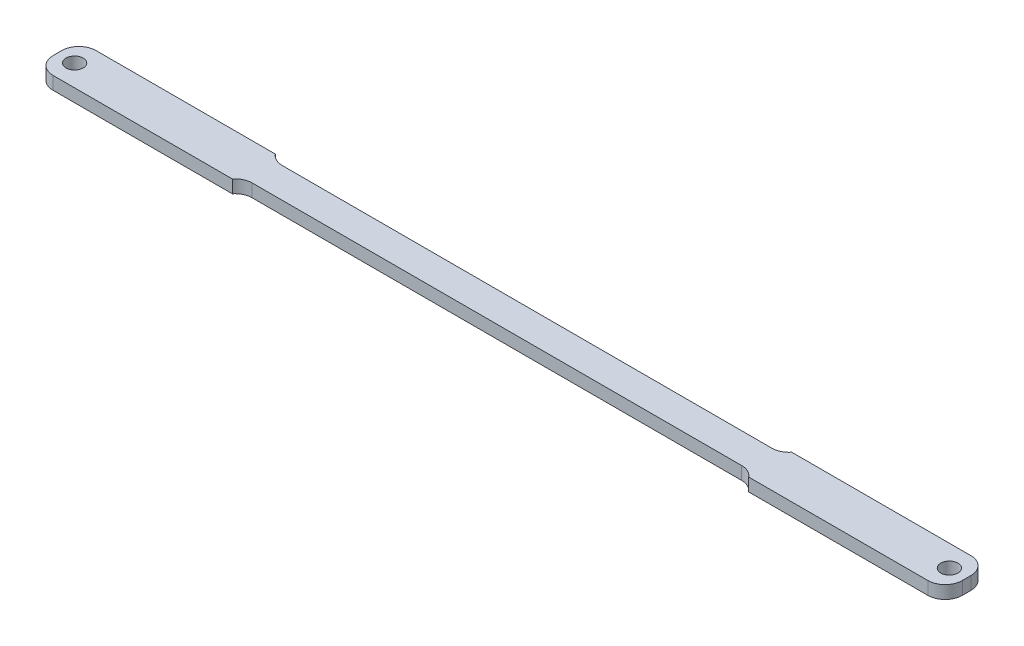
ISO-10303-21;
HEADER;
FILE_DESCRIPTION(('STEP AP214'),'2;1');
FILE_NAME('part.step','',(''),(''),'','','');
FILE_SCHEMA(('AUTOMOTIVE_DESIGN { 1 0 10303 214 1 1 1 1 }'));
ENDSEC;
DATA;
#1=APPLICATION_CONTEXT('core data for automotive mechanical design processes');
#2=APPLICATION_PROTOCOL_DEFINITION('international standard','automotive_design',2000,#1);
#3=PRODUCT_CONTEXT('',#1,'mechanical');
#4=PRODUCT('Part','Part','',(#3));
#5=PRODUCT_RELATED_PRODUCT_CATEGORY('part','',(#4));
#6=PRODUCT_DEFINITION_FORMATION('','',#4);
#7=PRODUCT_DEFINITION_CONTEXT('part definition',#1,'design');
#8=PRODUCT_DEFINITION('design','',#6,#7);
#9=PRODUCT_DEFINITION_SHAPE('','',#8);
#10=(LENGTH_UNIT() NAMED_UNIT(*) SI_UNIT(.MILLI.,.METRE.));
#11=(NAMED_UNIT(*) PLANE_ANGLE_UNIT() SI_UNIT($,.RADIAN.));
#12=(NAMED_UNIT(*) SI_UNIT($,.STERADIAN.) SOLID_ANGLE_UNIT());
#13=UNCERTAINTY_MEASURE_WITH_UNIT(LENGTH_MEASURE(1.E-05),#10,'distance_accuracy_value','');
#14=(GEOMETRIC_REPRESENTATION_CONTEXT(3) GLOBAL_UNCERTAINTY_ASSIGNED_CONTEXT((#13)) GLOBAL_UNIT_ASSIGNED_CONTEXT((#10,
#11,#12)) REPRESENTATION_CONTEXT('',''));
#15=CARTESIAN_POINT('',(0.,0.,0.));
#16=DIRECTION('',(0.,0.,1.));
#17=DIRECTION('',(1.,0.,0.));
#18=AXIS2_PLACEMENT_3D('',#15,#16,#17);
#19=CARTESIAN_POINT('',(-50.82,1.5,-2.5));
#20=DIRECTION('',(0.,0.,1.));
#21=DIRECTION('',(1.,0.,0.));
#22=AXIS2_PLACEMENT_3D('',#19,#20,#21);
#23=PLANE('',#22);
#24=DIRECTION('',(-1.,0.,0.));
#25=VECTOR('',#24,1.);
#26=CARTESIAN_POINT('',(-50.82,0.,-2.5));
#27=LINE('',#26,#25);
#28=CARTESIAN_POINT('',(50.82,0.,-2.5));
#29=VERTEX_POINT('',#28);
#30=CARTESIAN_POINT('',(30.,0.,-2.5));
#31=VERTEX_POINT('',#30);
#32=EDGE_CURVE('E308',#29,#31,#27,.T.);
#33=ORIENTED_EDGE('',*,*,#32,.T.);
#34=DIRECTION('',(0.,1.,0.));
#35=VECTOR('',#34,1.);
#36=CARTESIAN_POINT('',(30.,1.5,-2.5));
#37=LINE('',#36,#35);
#38=CARTESIAN_POINT('',(30.,1.5,-2.5));
#39=VERTEX_POINT('',#38);
#40=EDGE_CURVE('E186',#31,#39,#37,.T.);
#41=ORIENTED_EDGE('',*,*,#40,.T.);
#42=DIRECTION('',(-1.,0.,0.));
#43=VECTOR('',#42,1.);
#44=CARTESIAN_POINT('',(-50.82,1.5,-2.5));
#45=LINE('',#44,#43);
#46=CARTESIAN_POINT('',(50.82,1.5,-2.5));
#47=VERTEX_POINT('',#46);
#48=EDGE_CURVE('E237',#47,#39,#45,.T.);
#49=ORIENTED_EDGE('',*,*,#48,.F.);
#50=DIRECTION('',(0.,-1.,0.));
#51=VECTOR('',#50,1.);
#52=CARTESIAN_POINT('',(50.82,1.5,-2.5));
#53=LINE('',#52,#51);
#54=EDGE_CURVE('E341',#47,#29,#53,.T.);
#55=ORIENTED_EDGE('',*,*,#54,.T.);
#56=EDGE_LOOP('',(#33,#41,#49,#55));
#57=FACE_BOUND('',#56,.T.);
#58=ADVANCED_FACE('F39',(#57),#23,.F.);
#59=CARTESIAN_POINT('',(-50.82,1.5,2.5));
#60=DIRECTION('',(0.,0.,-1.));
#61=DIRECTION('',(-1.,0.,0.));
#62=AXIS2_PLACEMENT_3D('',#59,#60,#61);
#63=PLANE('',#62);
#64=DIRECTION('',(1.,0.,0.));
#65=VECTOR('',#64,1.);
#66=CARTESIAN_POINT('',(-50.82,1.5,2.5));
#67=LINE('',#66,#65);
#68=CARTESIAN_POINT('',(30.,1.5,2.5));
#69=VERTEX_POINT('',#68);
#70=CARTESIAN_POINT('',(50.82,1.5,2.5));
#71=VERTEX_POINT('',#70);
#72=EDGE_CURVE('E159',#69,#71,#67,.T.);
#73=ORIENTED_EDGE('',*,*,#72,.F.);
#74=DIRECTION('',(0.,-1.,0.));
#75=VECTOR('',#74,1.);
#76=CARTESIAN_POINT('',(30.,1.5,2.5));
#77=LINE('',#76,#75);
#78=CARTESIAN_POINT('',(30.,0.,2.5));
#79=VERTEX_POINT('',#78);
#80=EDGE_CURVE('E171',#69,#79,#77,.T.);
#81=ORIENTED_EDGE('',*,*,#80,.T.);
#82=DIRECTION('',(1.,0.,0.));
#83=VECTOR('',#82,1.);
#84=CARTESIAN_POINT('',(-50.82,0.,2.5));
#85=LINE('',#84,#83);
#86=CARTESIAN_POINT('',(50.82,0.,2.5));
#87=VERTEX_POINT('',#86);
#88=EDGE_CURVE('E321',#79,#87,#85,.T.);
#89=ORIENTED_EDGE('',*,*,#88,.T.);
#90=DIRECTION('',(0.,-1.,0.));
#91=VECTOR('',#90,1.);
#92=CARTESIAN_POINT('',(50.82,1.5,2.5));
#93=LINE('',#92,#91);
#94=EDGE_CURVE('E173',#71,#87,#93,.T.);
#95=ORIENTED_EDGE('',*,*,#94,.F.);
#96=EDGE_LOOP('',(#73,#81,#89,#95));
#97=FACE_BOUND('',#96,.T.);
#98=ADVANCED_FACE('F170',(#97),#63,.F.);
#99=CARTESIAN_POINT('',(50.82,1.5,0.5));
#100=DIRECTION('',(0.,1.,0.));
#101=DIRECTION('',(0.,0.,1.));
#102=AXIS2_PLACEMENT_3D('',#99,#100,#101);
#103=PLANE('',#102);
#104=ORIENTED_EDGE('',*,*,#48,.T.);
#105=CARTESIAN_POINT('',(28.4387505004004,1.5,-3.75000000000001));
#106=DIRECTION('',(0.,1.,0.));
#107=DIRECTION('',(0.,0.,1.));
#108=AXIS2_PLACEMENT_3D('',#105,#106,#107);
#109=CIRCLE('',#108,2.);
#110=CARTESIAN_POINT('',(28.4387505004004,1.5,-1.75000000000001));
#111=VERTEX_POINT('',#110);
#112=EDGE_CURVE('E208',#39,#111,#109,.F.);
#113=ORIENTED_EDGE('',*,*,#112,.T.);
#114=DIRECTION('',(1.,0.,0.));
#115=VECTOR('',#114,1.);
#116=CARTESIAN_POINT('',(-30.,1.5,-1.75000000000001));
#117=LINE('',#116,#115);
#118=CARTESIAN_POINT('',(-28.4387505004004,1.5,-1.75000000000001));
#119=VERTEX_POINT('',#118);
#120=EDGE_CURVE('E226',#119,#111,#117,.T.);
#121=ORIENTED_EDGE('',*,*,#120,.F.);
#122=CARTESIAN_POINT('',(-28.4387505004004,1.5,-3.75000000000001));
#123=DIRECTION('',(0.,1.,0.));
#124=DIRECTION('',(0.,0.,1.));
#125=AXIS2_PLACEMENT_3D('',#122,#123,#124);
#126=CIRCLE('',#125,2.);
#127=CARTESIAN_POINT('',(-30.,1.5,-2.5));
#128=VERTEX_POINT('',#127);
#129=EDGE_CURVE('E48',#119,#128,#126,.F.);
#130=ORIENTED_EDGE('',*,*,#129,.T.);
#131=CARTESIAN_POINT('',(-50.82,1.5,-2.5));
#132=VERTEX_POINT('',#131);
#133=EDGE_CURVE('E223',#128,#132,#45,.T.);
#134=ORIENTED_EDGE('',*,*,#133,.T.);
#135=CARTESIAN_POINT('',(-50.82,1.5,-0.5));
#136=DIRECTION('',(0.,1.,0.));
#137=DIRECTION('',(0.,0.,1.));
#138=AXIS2_PLACEMENT_3D('',#135,#136,#137);
#139=CIRCLE('',#138,2.);
#140=CARTESIAN_POINT('',(-52.82,1.5,-0.5));
#141=VERTEX_POINT('',#140);
#142=EDGE_CURVE('E289',#132,#141,#139,.T.);
#143=ORIENTED_EDGE('',*,*,#142,.T.);
#144=DIRECTION('',(0.,0.,1.));
#145=VECTOR('',#144,1.);
#146=CARTESIAN_POINT('',(-52.82,1.5,-0.5));
#147=LINE('',#146,#145);
#148=CARTESIAN_POINT('',(-52.82,1.5,0.499999999999999));
#149=VERTEX_POINT('',#148);
#150=EDGE_CURVE('E292',#141,#149,#147,.T.);
#151=ORIENTED_EDGE('',*,*,#150,.T.);
#152=CARTESIAN_POINT('',(-50.82,1.5,0.5));
#153=DIRECTION('',(0.,1.,0.));
#154=DIRECTION('',(0.,0.,1.));
#155=AXIS2_PLACEMENT_3D('',#152,#153,#154);
#156=CIRCLE('',#155,2.);
#157=CARTESIAN_POINT('',(-50.82,1.5,2.5));
#158=VERTEX_POINT('',#157);
#159=EDGE_CURVE('E177',#149,#158,#156,.T.);
#160=ORIENTED_EDGE('',*,*,#159,.T.);
#161=CARTESIAN_POINT('',(-30.,1.5,2.5));
#162=VERTEX_POINT('',#161);
#163=EDGE_CURVE('E176',#158,#162,#67,.T.);
#164=ORIENTED_EDGE('',*,*,#163,.T.);
#165=CARTESIAN_POINT('',(-28.4387505004004,1.5,3.75));
#166=DIRECTION('',(0.,1.,0.));
#167=DIRECTION('',(0.,0.,1.));
#168=AXIS2_PLACEMENT_3D('',#165,#166,#167);
#169=CIRCLE('',#168,2.);
#170=CARTESIAN_POINT('',(-28.4387505004004,1.5,1.75));
#171=VERTEX_POINT('',#170);
#172=EDGE_CURVE('E215',#162,#171,#169,.F.);
#173=ORIENTED_EDGE('',*,*,#172,.T.);
#174=DIRECTION('',(-1.,0.,0.));
#175=VECTOR('',#174,1.);
#176=CARTESIAN_POINT('',(-30.,1.5,1.75));
#177=LINE('',#176,#175);
#178=CARTESIAN_POINT('',(28.4387505004004,1.5,1.75));
#179=VERTEX_POINT('',#178);
#180=EDGE_CURVE('E161',#179,#171,#177,.T.);
#181=ORIENTED_EDGE('',*,*,#180,.F.);
#182=CARTESIAN_POINT('',(28.4387505004004,1.5,3.75));
#183=DIRECTION('',(0.,1.,0.));
#184=DIRECTION('',(0.,0.,1.));
#185=AXIS2_PLACEMENT_3D('',#182,#183,#184);
#186=CIRCLE('',#185,2.);
#187=EDGE_CURVE('E153',#179,#69,#186,.F.);
#188=ORIENTED_EDGE('',*,*,#187,.T.);
#189=ORIENTED_EDGE('',*,*,#72,.T.);
#190=CARTESIAN_POINT('',(50.82,1.5,0.5));
#191=DIRECTION('',(0.,1.,0.));
#192=DIRECTION('',(0.,0.,1.));
#193=AXIS2_PLACEMENT_3D('',#190,#191,#192);
#194=CIRCLE('',#193,2.);
#195=CARTESIAN_POINT('',(52.82,1.5,0.499999999999999));
#196=VERTEX_POINT('',#195);
#197=EDGE_CURVE('E279',#71,#196,#194,.T.);
#198=ORIENTED_EDGE('',*,*,#197,.T.);
#199=DIRECTION('',(0.,0.,-1.));
#200=VECTOR('',#199,1.);
#201=CARTESIAN_POINT('',(52.82,1.5,-0.500000000000001));
#202=LINE('',#201,#200);
#203=CARTESIAN_POINT('',(52.82,1.5,-0.500000000000001));
#204=VERTEX_POINT('',#203);
#205=EDGE_CURVE('E282',#196,#204,#202,.T.);
#206=ORIENTED_EDGE('',*,*,#205,.T.);
#207=CARTESIAN_POINT('',(50.82,1.5,-0.5));
#208=DIRECTION('',(0.,1.,0.));
#209=DIRECTION('',(0.,0.,-1.));
#210=AXIS2_PLACEMENT_3D('',#207,#208,#209);
#211=CIRCLE('',#210,2.);
#212=EDGE_CURVE('E238',#204,#47,#211,.T.);
#213=ORIENTED_EDGE('',*,*,#212,.T.);
#214=EDGE_LOOP('',(#104,#113,#121,#130,#134,#143,#151,#160,#164,#173,#181,#188,#189,#198,#206,#213));
#215=FACE_BOUND('',#214,.T.);
#216=CARTESIAN_POINT('',(-50.82,1.5,0.));
#217=DIRECTION('',(0.,1.,0.));
#218=DIRECTION('',(0.,0.,1.));
#219=AXIS2_PLACEMENT_3D('',#216,#217,#218);
#220=CIRCLE('',#219,0.999999999999998);
#221=CARTESIAN_POINT('',(-50.82,1.5,0.999999999999998));
#222=VERTEX_POINT('',#221);
#223=EDGE_CURVE('E271',#222,#222,#220,.T.);
#224=ORIENTED_EDGE('',*,*,#223,.F.);
#225=EDGE_LOOP('',(#224));
#226=FACE_BOUND('',#225,.T.);
#227=CARTESIAN_POINT('',(50.82,1.5,0.));
#228=DIRECTION('',(0.,1.,0.));
#229=DIRECTION('',(0.,0.,1.));
#230=AXIS2_PLACEMENT_3D('',#227,#228,#229);
#231=CIRCLE('',#230,0.999999999999998);
#232=CARTESIAN_POINT('',(50.82,1.5,0.999999999999999));
#233=VERTEX_POINT('',#232);
#234=EDGE_CURVE('E258',#233,#233,#231,.T.);
#235=ORIENTED_EDGE('',*,*,#234,.F.);
#236=EDGE_LOOP('',(#235));
#237=FACE_BOUND('',#236,.T.);
#238=ADVANCED_FACE('F156',(#215,#226,#237),#103,.T.);
#239=CARTESIAN_POINT('',(50.82,0.,0.5));
#240=DIRECTION('',(0.,1.,0.));
#241=DIRECTION('',(0.,0.,1.));
#242=AXIS2_PLACEMENT_3D('',#239,#240,#241);
#243=PLANE('',#242);
#244=CARTESIAN_POINT('',(-30.,0.,-2.5));
#245=VERTEX_POINT('',#244);
#246=CARTESIAN_POINT('',(-50.82,0.,-2.5));
#247=VERTEX_POINT('',#246);
#248=EDGE_CURVE('E248',#245,#247,#27,.T.);
#249=ORIENTED_EDGE('',*,*,#248,.F.);
#250=CARTESIAN_POINT('',(-28.4387505004004,0.,-3.75000000000001));
#251=DIRECTION('',(0.,1.,0.));
#252=DIRECTION('',(0.,0.,1.));
#253=AXIS2_PLACEMENT_3D('',#250,#251,#252);
#254=CIRCLE('',#253,2.);
#255=CARTESIAN_POINT('',(-28.4387505004004,0.,-1.75000000000001));
#256=VERTEX_POINT('',#255);
#257=EDGE_CURVE('E11',#245,#256,#254,.T.);
#258=ORIENTED_EDGE('',*,*,#257,.T.);
#259=DIRECTION('',(1.,0.,0.));
#260=VECTOR('',#259,1.);
#261=CARTESIAN_POINT('',(-30.,0.,-1.75000000000001));
#262=LINE('',#261,#260);
#263=CARTESIAN_POINT('',(28.4387505004004,0.,-1.75000000000001));
#264=VERTEX_POINT('',#263);
#265=EDGE_CURVE('E245',#256,#264,#262,.T.);
#266=ORIENTED_EDGE('',*,*,#265,.T.);
#267=CARTESIAN_POINT('',(28.4387505004004,0.,-3.75000000000001));
#268=DIRECTION('',(0.,1.,0.));
#269=DIRECTION('',(0.,0.,1.));
#270=AXIS2_PLACEMENT_3D('',#267,#268,#269);
#271=CIRCLE('',#270,2.);
#272=EDGE_CURVE('E167',#264,#31,#271,.T.);
#273=ORIENTED_EDGE('',*,*,#272,.T.);
#274=ORIENTED_EDGE('',*,*,#32,.F.);
#275=CARTESIAN_POINT('',(50.82,0.,-0.5));
#276=DIRECTION('',(0.,1.,0.));
#277=DIRECTION('',(0.,0.,-1.));
#278=AXIS2_PLACEMENT_3D('',#275,#276,#277);
#279=CIRCLE('',#278,2.);
#280=CARTESIAN_POINT('',(52.82,0.,-0.500000000000001));
#281=VERTEX_POINT('',#280);
#282=EDGE_CURVE('E305',#281,#29,#279,.T.);
#283=ORIENTED_EDGE('',*,*,#282,.F.);
#284=DIRECTION('',(0.,0.,-1.));
#285=VECTOR('',#284,1.);
#286=CARTESIAN_POINT('',(52.82,0.,-0.500000000000001));
#287=LINE('',#286,#285);
#288=CARTESIAN_POINT('',(52.82,0.,0.499999999999999));
#289=VERTEX_POINT('',#288);
#290=EDGE_CURVE('E302',#289,#281,#287,.T.);
#291=ORIENTED_EDGE('',*,*,#290,.F.);
#292=CARTESIAN_POINT('',(50.82,0.,0.5));
#293=DIRECTION('',(0.,1.,0.));
#294=DIRECTION('',(0.,0.,1.));
#295=AXIS2_PLACEMENT_3D('',#292,#293,#294);
#296=CIRCLE('',#295,2.);
#297=EDGE_CURVE('E275',#87,#289,#296,.T.);
#298=ORIENTED_EDGE('',*,*,#297,.F.);
#299=ORIENTED_EDGE('',*,*,#88,.F.);
#300=CARTESIAN_POINT('',(28.4387505004004,0.,3.75));
#301=DIRECTION('',(0.,1.,0.));
#302=DIRECTION('',(0.,0.,1.));
#303=AXIS2_PLACEMENT_3D('',#300,#301,#302);
#304=CIRCLE('',#303,2.);
#305=CARTESIAN_POINT('',(28.4387505004004,0.,1.75));
#306=VERTEX_POINT('',#305);
#307=EDGE_CURVE('E62',#79,#306,#304,.T.);
#308=ORIENTED_EDGE('',*,*,#307,.T.);
#309=DIRECTION('',(-1.,0.,0.));
#310=VECTOR('',#309,1.);
#311=CARTESIAN_POINT('',(-30.,0.,1.75));
#312=LINE('',#311,#310);
#313=CARTESIAN_POINT('',(-28.4387505004004,0.,1.75));
#314=VERTEX_POINT('',#313);
#315=EDGE_CURVE('E260',#306,#314,#312,.T.);
#316=ORIENTED_EDGE('',*,*,#315,.T.);
#317=CARTESIAN_POINT('',(-28.4387505004004,0.,3.75));
#318=DIRECTION('',(0.,1.,0.));
#319=DIRECTION('',(0.,0.,1.));
#320=AXIS2_PLACEMENT_3D('',#317,#318,#319);
#321=CIRCLE('',#320,2.);
#322=CARTESIAN_POINT('',(-30.,0.,2.5));
#323=VERTEX_POINT('',#322);
#324=EDGE_CURVE('E218',#314,#323,#321,.T.);
#325=ORIENTED_EDGE('',*,*,#324,.T.);
#326=CARTESIAN_POINT('',(-50.82,0.,2.5));
#327=VERTEX_POINT('',#326);
#328=EDGE_CURVE('E283',#327,#323,#85,.T.);
#329=ORIENTED_EDGE('',*,*,#328,.F.);
#330=CARTESIAN_POINT('',(-50.82,0.,0.5));
#331=DIRECTION('',(0.,1.,0.));
#332=DIRECTION('',(0.,0.,1.));
#333=AXIS2_PLACEMENT_3D('',#330,#331,#332);
#334=CIRCLE('',#333,2.);
#335=CARTESIAN_POINT('',(-52.82,0.,0.499999999999999));
#336=VERTEX_POINT('',#335);
#337=EDGE_CURVE('E318',#336,#327,#334,.T.);
#338=ORIENTED_EDGE('',*,*,#337,.F.);
#339=DIRECTION('',(0.,0.,1.));
#340=VECTOR('',#339,1.);
#341=CARTESIAN_POINT('',(-52.82,0.,-0.5));
#342=LINE('',#341,#340);
#343=CARTESIAN_POINT('',(-52.82,0.,-0.5));
#344=VERTEX_POINT('',#343);
#345=EDGE_CURVE('E315',#344,#336,#342,.T.);
#346=ORIENTED_EDGE('',*,*,#345,.F.);
#347=CARTESIAN_POINT('',(-50.82,0.,-0.5));
#348=DIRECTION('',(0.,1.,0.));
#349=DIRECTION('',(0.,0.,1.));
#350=AXIS2_PLACEMENT_3D('',#347,#348,#349);
#351=CIRCLE('',#350,2.);
#352=EDGE_CURVE('E312',#247,#344,#351,.T.);
#353=ORIENTED_EDGE('',*,*,#352,.F.);
#354=EDGE_LOOP('',(#249,#258,#266,#273,#274,#283,#291,#298,#299,#308,#316,#325,#329,#338,#346,#353));
#355=FACE_BOUND('',#354,.T.);
#356=CARTESIAN_POINT('',(-50.82,0.,0.));
#357=DIRECTION('',(0.,1.,0.));
#358=DIRECTION('',(0.,0.,1.));
#359=AXIS2_PLACEMENT_3D('',#356,#357,#358);
#360=CIRCLE('',#359,0.999999999999998);
#361=CARTESIAN_POINT('',(-50.82,0.,0.999999999999998));
#362=VERTEX_POINT('',#361);
#363=EDGE_CURVE('E269',#362,#362,#360,.T.);
#364=ORIENTED_EDGE('',*,*,#363,.T.);
#365=EDGE_LOOP('',(#364));
#366=FACE_BOUND('',#365,.T.);
#367=CARTESIAN_POINT('',(50.82,0.,0.));
#368=DIRECTION('',(0.,1.,0.));
#369=DIRECTION('',(0.,0.,1.));
#370=AXIS2_PLACEMENT_3D('',#367,#368,#369);
#371=CIRCLE('',#370,0.999999999999998);
#372=CARTESIAN_POINT('',(50.82,0.,0.999999999999999));
#373=VERTEX_POINT('',#372);
#374=EDGE_CURVE('E253',#373,#373,#371,.T.);
#375=ORIENTED_EDGE('',*,*,#374,.T.);
#376=EDGE_LOOP('',(#375));
#377=FACE_BOUND('',#376,.T.);
#378=ADVANCED_FACE('F243',(#355,#366,#377),#243,.F.);
#379=CARTESIAN_POINT('',(50.82,1.5,0.5));
#380=DIRECTION('',(0.,-1.,0.));
#381=DIRECTION('',(0.,0.,-1.));
#382=AXIS2_PLACEMENT_3D('',#379,#380,#381);
#383=CYLINDRICAL_SURFACE('',#382,2.);
#384=ORIENTED_EDGE('',*,*,#297,.T.);
#385=DIRECTION('',(0.,-1.,0.));
#386=VECTOR('',#385,1.);
#387=CARTESIAN_POINT('',(52.82,1.5,0.499999999999999));
#388=LINE('',#387,#386);
#389=EDGE_CURVE('E189',#196,#289,#388,.T.);
#390=ORIENTED_EDGE('',*,*,#389,.F.);
#391=ORIENTED_EDGE('',*,*,#197,.F.);
#392=ORIENTED_EDGE('',*,*,#94,.T.);
#393=EDGE_LOOP('',(#384,#390,#391,#392));
#394=FACE_BOUND('',#393,.T.);
#395=ADVANCED_FACE('F356',(#394),#383,.T.);
#396=CARTESIAN_POINT('',(52.82,1.5,-0.500000000000001));
#397=DIRECTION('',(-1.,0.,0.));
#398=DIRECTION('',(0.,0.,1.));
#399=AXIS2_PLACEMENT_3D('',#396,#397,#398);
#400=PLANE('',#399);
#401=ORIENTED_EDGE('',*,*,#290,.T.);
#402=DIRECTION('',(0.,-1.,0.));
#403=VECTOR('',#402,1.);
#404=CARTESIAN_POINT('',(52.82,1.5,-0.500000000000001));
#405=LINE('',#404,#403);
#406=EDGE_CURVE('E345',#204,#281,#405,.T.);
#407=ORIENTED_EDGE('',*,*,#406,.F.);
#408=ORIENTED_EDGE('',*,*,#205,.F.);
#409=ORIENTED_EDGE('',*,*,#389,.T.);
#410=EDGE_LOOP('',(#401,#407,#408,#409));
#411=FACE_BOUND('',#410,.T.);
#412=ADVANCED_FACE('F352',(#411),#400,.F.);
#413=CARTESIAN_POINT('',(50.82,1.5,-0.5));
#414=DIRECTION('',(0.,-1.,0.));
#415=DIRECTION('',(0.,0.,-1.));
#416=AXIS2_PLACEMENT_3D('',#413,#414,#415);
#417=CYLINDRICAL_SURFACE('',#416,2.);
#418=ORIENTED_EDGE('',*,*,#282,.T.);
#419=ORIENTED_EDGE('',*,*,#54,.F.);
#420=ORIENTED_EDGE('',*,*,#212,.F.);
#421=ORIENTED_EDGE('',*,*,#406,.T.);
#422=EDGE_LOOP('',(#418,#419,#420,#421));
#423=FACE_BOUND('',#422,.T.);
#424=ADVANCED_FACE('F361',(#423),#417,.T.);
#425=ORIENTED_EDGE('',*,*,#133,.F.);
#426=DIRECTION('',(0.,-1.,0.));
#427=VECTOR('',#426,1.);
#428=CARTESIAN_POINT('',(-30.,1.5,-2.5));
#429=LINE('',#428,#427);
#430=EDGE_CURVE('E181',#128,#245,#429,.T.);
#431=ORIENTED_EDGE('',*,*,#430,.T.);
#432=ORIENTED_EDGE('',*,*,#248,.T.);
#433=DIRECTION('',(0.,-1.,0.));
#434=VECTOR('',#433,1.);
#435=CARTESIAN_POINT('',(-50.82,1.5,-2.5));
#436=LINE('',#435,#434);
#437=EDGE_CURVE('E234',#132,#247,#436,.T.);
#438=ORIENTED_EDGE('',*,*,#437,.F.);
#439=EDGE_LOOP('',(#425,#431,#432,#438));
#440=FACE_BOUND('',#439,.T.);
#441=ADVANCED_FACE('F231',(#440),#23,.F.);
#442=CARTESIAN_POINT('',(-50.82,1.5,-0.5));
#443=DIRECTION('',(0.,-1.,0.));
#444=DIRECTION('',(0.,0.,-1.));
#445=AXIS2_PLACEMENT_3D('',#442,#443,#444);
#446=CYLINDRICAL_SURFACE('',#445,2.);
#447=ORIENTED_EDGE('',*,*,#352,.T.);
#448=DIRECTION('',(0.,-1.,0.));
#449=VECTOR('',#448,1.);
#450=CARTESIAN_POINT('',(-52.82,1.5,-0.5));
#451=LINE('',#450,#449);
#452=EDGE_CURVE('E335',#141,#344,#451,.T.);
#453=ORIENTED_EDGE('',*,*,#452,.F.);
#454=ORIENTED_EDGE('',*,*,#142,.F.);
#455=ORIENTED_EDGE('',*,*,#437,.T.);
#456=EDGE_LOOP('',(#447,#453,#454,#455));
#457=FACE_BOUND('',#456,.T.);
#458=ADVANCED_FACE('F389',(#457),#446,.T.);
#459=CARTESIAN_POINT('',(-52.82,1.5,-0.5));
#460=DIRECTION('',(1.,0.,0.));
#461=DIRECTION('',(0.,0.,-1.));
#462=AXIS2_PLACEMENT_3D('',#459,#460,#461);
#463=PLANE('',#462);
#464=ORIENTED_EDGE('',*,*,#345,.T.);
#465=DIRECTION('',(0.,-1.,0.));
#466=VECTOR('',#465,1.);
#467=CARTESIAN_POINT('',(-52.82,1.5,0.499999999999999));
#468=LINE('',#467,#466);
#469=EDGE_CURVE('E331',#149,#336,#468,.T.);
#470=ORIENTED_EDGE('',*,*,#469,.F.);
#471=ORIENTED_EDGE('',*,*,#150,.F.);
#472=ORIENTED_EDGE('',*,*,#452,.T.);
#473=EDGE_LOOP('',(#464,#470,#471,#472));
#474=FACE_BOUND('',#473,.T.);
#475=ADVANCED_FACE('F394',(#474),#463,.F.);
#476=CARTESIAN_POINT('',(-50.82,1.5,0.5));
#477=DIRECTION('',(0.,-1.,0.));
#478=DIRECTION('',(0.,0.,-1.));
#479=AXIS2_PLACEMENT_3D('',#476,#477,#478);
#480=CYLINDRICAL_SURFACE('',#479,2.);
#481=ORIENTED_EDGE('',*,*,#337,.T.);
#482=DIRECTION('',(0.,-1.,0.));
#483=VECTOR('',#482,1.);
#484=CARTESIAN_POINT('',(-50.82,1.5,2.5));
#485=LINE('',#484,#483);
#486=EDGE_CURVE('E327',#158,#327,#485,.T.);
#487=ORIENTED_EDGE('',*,*,#486,.F.);
#488=ORIENTED_EDGE('',*,*,#159,.F.);
#489=ORIENTED_EDGE('',*,*,#469,.T.);
#490=EDGE_LOOP('',(#481,#487,#488,#489));
#491=FACE_BOUND('',#490,.T.);
#492=ADVANCED_FACE('F413',(#491),#480,.T.);
#493=ORIENTED_EDGE('',*,*,#328,.T.);
#494=DIRECTION('',(0.,1.,0.));
#495=VECTOR('',#494,1.);
#496=CARTESIAN_POINT('',(-30.,1.5,2.5));
#497=LINE('',#496,#495);
#498=EDGE_CURVE('E182',#323,#162,#497,.T.);
#499=ORIENTED_EDGE('',*,*,#498,.T.);
#500=ORIENTED_EDGE('',*,*,#163,.F.);
#501=ORIENTED_EDGE('',*,*,#486,.T.);
#502=EDGE_LOOP('',(#493,#499,#500,#501));
#503=FACE_BOUND('',#502,.T.);
#504=ADVANCED_FACE('F385',(#503),#63,.F.);
#505=CARTESIAN_POINT('',(-50.82,1.5,0.));
#506=DIRECTION('',(0.,-1.,0.));
#507=DIRECTION('',(0.,0.,-1.));
#508=AXIS2_PLACEMENT_3D('',#505,#506,#507);
#509=CYLINDRICAL_SURFACE('',#508,0.999999999999998);
#510=ORIENTED_EDGE('',*,*,#223,.T.);
#511=EDGE_LOOP('',(#510));
#512=FACE_BOUND('',#511,.T.);
#513=ORIENTED_EDGE('',*,*,#363,.F.);
#514=EDGE_LOOP('',(#513));
#515=FACE_BOUND('',#514,.T.);
#516=ADVANCED_FACE('F412',(#512,#515),#509,.F.);
#517=CARTESIAN_POINT('',(50.82,1.5,0.));
#518=DIRECTION('',(0.,-1.,0.));
#519=DIRECTION('',(0.,0.,-1.));
#520=AXIS2_PLACEMENT_3D('',#517,#518,#519);
#521=CYLINDRICAL_SURFACE('',#520,0.999999999999998);
#522=ORIENTED_EDGE('',*,*,#234,.T.);
#523=EDGE_LOOP('',(#522));
#524=FACE_BOUND('',#523,.T.);
#525=ORIENTED_EDGE('',*,*,#374,.F.);
#526=EDGE_LOOP('',(#525));
#527=FACE_BOUND('',#526,.T.);
#528=ADVANCED_FACE('F435',(#524,#527),#521,.F.);
#529=CARTESIAN_POINT('',(-30.,0.,1.75));
#530=DIRECTION('',(0.,0.,-1.));
#531=DIRECTION('',(-1.,0.,0.));
#532=AXIS2_PLACEMENT_3D('',#529,#530,#531);
#533=PLANE('',#532);
#534=ORIENTED_EDGE('',*,*,#315,.F.);
#535=DIRECTION('',(0.,1.,0.));
#536=VECTOR('',#535,1.);
#537=CARTESIAN_POINT('',(28.4387505004004,0.,1.75));
#538=LINE('',#537,#536);
#539=EDGE_CURVE('E205',#306,#179,#538,.T.);
#540=ORIENTED_EDGE('',*,*,#539,.T.);
#541=ORIENTED_EDGE('',*,*,#180,.T.);
#542=DIRECTION('',(0.,-1.,0.));
#543=VECTOR('',#542,1.);
#544=CARTESIAN_POINT('',(-28.4387505004004,0.,1.75));
#545=LINE('',#544,#543);
#546=EDGE_CURVE('E55',#171,#314,#545,.T.);
#547=ORIENTED_EDGE('',*,*,#546,.T.);
#548=EDGE_LOOP('',(#534,#540,#541,#547));
#549=FACE_BOUND('',#548,.T.);
#550=ADVANCED_FACE('F376',(#549),#533,.F.);
#551=CARTESIAN_POINT('',(-30.,0.,-1.75000000000001));
#552=DIRECTION('',(0.,0.,1.));
#553=DIRECTION('',(1.,0.,0.));
#554=AXIS2_PLACEMENT_3D('',#551,#552,#553);
#555=PLANE('',#554);
#556=ORIENTED_EDGE('',*,*,#120,.T.);
#557=DIRECTION('',(0.,-1.,0.));
#558=VECTOR('',#557,1.);
#559=CARTESIAN_POINT('',(28.4387505004004,0.,-1.75000000000001));
#560=LINE('',#559,#558);
#561=EDGE_CURVE('E200',#111,#264,#560,.T.);
#562=ORIENTED_EDGE('',*,*,#561,.T.);
#563=ORIENTED_EDGE('',*,*,#265,.F.);
#564=DIRECTION('',(0.,1.,0.));
#565=VECTOR('',#564,1.);
#566=CARTESIAN_POINT('',(-28.4387505004004,0.,-1.75000000000001));
#567=LINE('',#566,#565);
#568=EDGE_CURVE('E196',#256,#119,#567,.T.);
#569=ORIENTED_EDGE('',*,*,#568,.T.);
#570=EDGE_LOOP('',(#556,#562,#563,#569));
#571=FACE_BOUND('',#570,.T.);
#572=ADVANCED_FACE('F250',(#571),#555,.F.);
#573=CARTESIAN_POINT('',(28.4387505004004,0.,-3.75000000000001));
#574=DIRECTION('',(0.,-1.,0.));
#575=DIRECTION('',(0.,0.,-1.));
#576=AXIS2_PLACEMENT_3D('',#573,#574,#575);
#577=CYLINDRICAL_SURFACE('',#576,2.);
#578=ORIENTED_EDGE('',*,*,#272,.F.);
#579=ORIENTED_EDGE('',*,*,#561,.F.);
#580=ORIENTED_EDGE('',*,*,#112,.F.);
#581=ORIENTED_EDGE('',*,*,#40,.F.);
#582=EDGE_LOOP('',(#578,#579,#580,#581));
#583=FACE_BOUND('',#582,.T.);
#584=ADVANCED_FACE('F367',(#583),#577,.F.);
#585=CARTESIAN_POINT('',(28.4387505004004,0.,3.75));
#586=DIRECTION('',(0.,1.,0.));
#587=DIRECTION('',(0.,0.,1.));
#588=AXIS2_PLACEMENT_3D('',#585,#586,#587);
#589=CYLINDRICAL_SURFACE('',#588,2.);
#590=ORIENTED_EDGE('',*,*,#307,.F.);
#591=ORIENTED_EDGE('',*,*,#80,.F.);
#592=ORIENTED_EDGE('',*,*,#187,.F.);
#593=ORIENTED_EDGE('',*,*,#539,.F.);
#594=EDGE_LOOP('',(#590,#591,#592,#593));
#595=FACE_BOUND('',#594,.T.);
#596=ADVANCED_FACE('F179',(#595),#589,.F.);
#597=CARTESIAN_POINT('',(-28.4387505004004,0.,3.75));
#598=DIRECTION('',(0.,-1.,0.));
#599=DIRECTION('',(0.,0.,-1.));
#600=AXIS2_PLACEMENT_3D('',#597,#598,#599);
#601=CYLINDRICAL_SURFACE('',#600,2.);
#602=ORIENTED_EDGE('',*,*,#324,.F.);
#603=ORIENTED_EDGE('',*,*,#546,.F.);
#604=ORIENTED_EDGE('',*,*,#172,.F.);
#605=ORIENTED_EDGE('',*,*,#498,.F.);
#606=EDGE_LOOP('',(#602,#603,#604,#605));
#607=FACE_BOUND('',#606,.T.);
#608=ADVANCED_FACE('F374',(#607),#601,.F.);
#609=CARTESIAN_POINT('',(-28.4387505004004,0.,-3.75000000000001));
#610=DIRECTION('',(0.,1.,0.));
#611=DIRECTION('',(0.,0.,1.));
#612=AXIS2_PLACEMENT_3D('',#609,#610,#611);
#613=CYLINDRICAL_SURFACE('',#612,2.);
#614=ORIENTED_EDGE('',*,*,#257,.F.);
#615=ORIENTED_EDGE('',*,*,#430,.F.);
#616=ORIENTED_EDGE('',*,*,#129,.F.);
#617=ORIENTED_EDGE('',*,*,#568,.F.);
#618=EDGE_LOOP('',(#614,#615,#616,#617));
#619=FACE_BOUND('',#618,.T.);
#620=ADVANCED_FACE('F41',(#619),#613,.F.);
#621=CLOSED_SHELL('',(#58,#98,#238,#378,#395,#412,#424,#441,#458,#475,#492,#504,#516,#528,#550,
#572,#584,#596,#608,#620));
#622=MANIFOLD_SOLID_BREP('B2',#621);
#623=ADVANCED_BREP_SHAPE_REPRESENTATION('',(#18,#622),#14);
#624=SHAPE_DEFINITION_REPRESENTATION(#9,#623);
ENDSEC;
END-ISO-10303-21;
